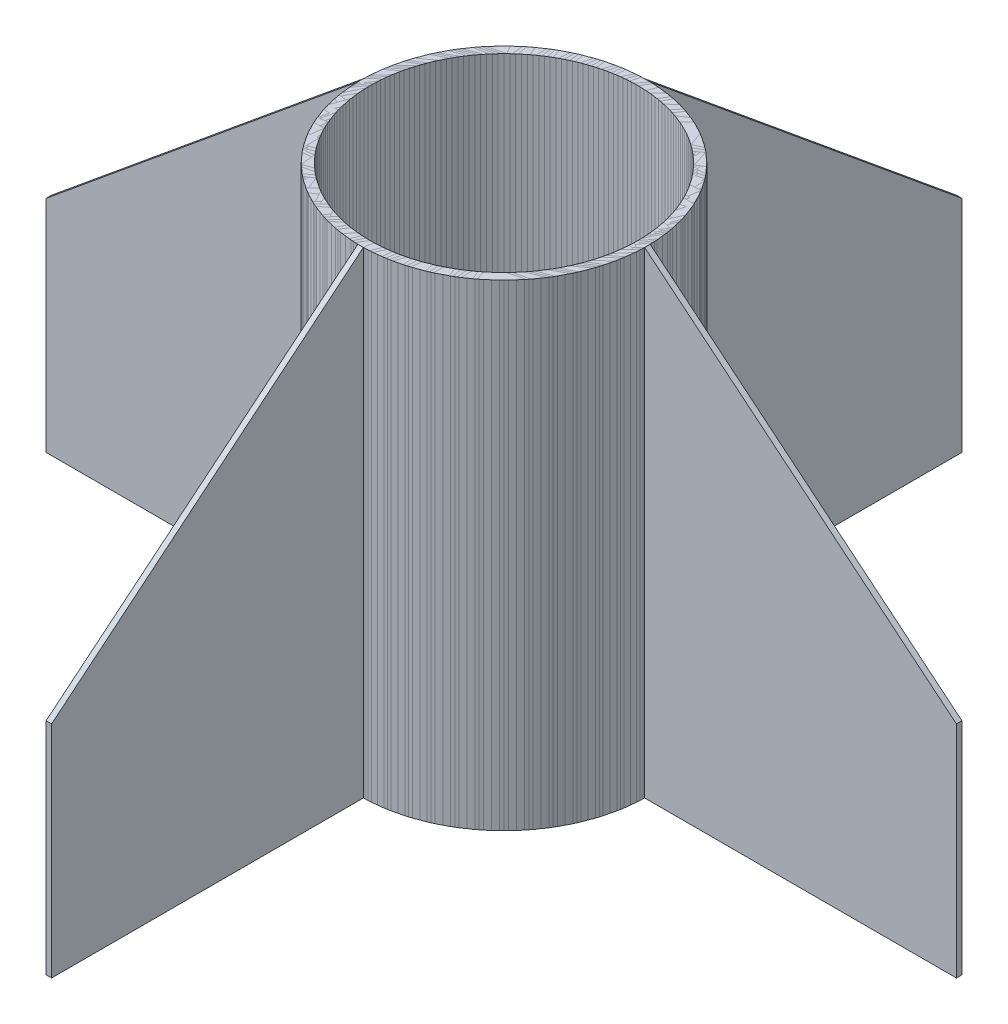
ISO-10303-21;
HEADER;
FILE_DESCRIPTION(('STEP AP214'),'2;1');
FILE_NAME('part.step','',(''),(''),'','','');
FILE_SCHEMA(('AUTOMOTIVE_DESIGN { 1 0 10303 214 1 1 1 1 }'));
ENDSEC;
DATA;
#1=APPLICATION_CONTEXT('core data for automotive mechanical design processes');
#2=APPLICATION_PROTOCOL_DEFINITION('international standard','automotive_design',2000,#1);
#3=PRODUCT_CONTEXT('',#1,'mechanical');
#4=PRODUCT('Part','Part','',(#3));
#5=PRODUCT_RELATED_PRODUCT_CATEGORY('part','',(#4));
#6=PRODUCT_DEFINITION_FORMATION('','',#4);
#7=PRODUCT_DEFINITION_CONTEXT('part definition',#1,'design');
#8=PRODUCT_DEFINITION('design','',#6,#7);
#9=PRODUCT_DEFINITION_SHAPE('','',#8);
#10=(LENGTH_UNIT() NAMED_UNIT(*) SI_UNIT(.MILLI.,.METRE.));
#11=(NAMED_UNIT(*) PLANE_ANGLE_UNIT() SI_UNIT($,.RADIAN.));
#12=(NAMED_UNIT(*) SI_UNIT($,.STERADIAN.) SOLID_ANGLE_UNIT());
#13=UNCERTAINTY_MEASURE_WITH_UNIT(LENGTH_MEASURE(1.E-05),#10,'distance_accuracy_value','');
#14=(GEOMETRIC_REPRESENTATION_CONTEXT(3) GLOBAL_UNCERTAINTY_ASSIGNED_CONTEXT((#13)) GLOBAL_UNIT_ASSIGNED_CONTEXT((#10,
#11,#12)) REPRESENTATION_CONTEXT('',''));
#15=CARTESIAN_POINT('',(0.,0.,0.));
#16=DIRECTION('',(0.,0.,1.));
#17=DIRECTION('',(1.,0.,0.));
#18=AXIS2_PLACEMENT_3D('',#15,#16,#17);
#19=CARTESIAN_POINT('',(0.,260.,0.));
#20=DIRECTION('',(0.,-1.,0.));
#21=DIRECTION('',(-1.,0.,0.));
#22=AXIS2_PLACEMENT_3D('',#19,#20,#21);
#23=CYLINDRICAL_SURFACE('',#22,78.2);
#24=DIRECTION('',(0.,-1.,0.));
#25=VECTOR('',#24,1.);
#26=CARTESIAN_POINT('',(-1.49999999999918,260.,-78.1856124872089));
#27=LINE('',#26,#25);
#28=CARTESIAN_POINT('',(-1.49999999999918,0.,-78.1856124872089));
#29=VERTEX_POINT('',#28);
#30=CARTESIAN_POINT('',(-1.49999999999918,260.,-78.1856124872089));
#31=VERTEX_POINT('',#30);
#32=EDGE_CURVE('E12',#29,#31,#27,.F.);
#33=ORIENTED_EDGE('',*,*,#32,.F.);
#34=CARTESIAN_POINT('',(0.,0.,0.));
#35=DIRECTION('',(0.,1.,0.));
#36=DIRECTION('',(1.,0.,0.));
#37=AXIS2_PLACEMENT_3D('',#34,#35,#36);
#38=CIRCLE('',#37,78.2);
#39=CARTESIAN_POINT('',(1.50000000000082,0.,-78.1856124872089));
#40=VERTEX_POINT('',#39);
#41=EDGE_CURVE('E135',#29,#40,#38,.T.);
#42=ORIENTED_EDGE('',*,*,#41,.T.);
#43=DIRECTION('',(0.,-1.,0.));
#44=VECTOR('',#43,1.);
#45=CARTESIAN_POINT('',(1.50000000000082,260.,-78.1856124872089));
#46=LINE('',#45,#44);
#47=CARTESIAN_POINT('',(1.50000000000082,260.,-78.1856124872089));
#48=VERTEX_POINT('',#47);
#49=EDGE_CURVE('E57',#40,#48,#46,.F.);
#50=ORIENTED_EDGE('',*,*,#49,.T.);
#51=CARTESIAN_POINT('',(0.,260.,0.));
#52=DIRECTION('',(0.,1.,0.));
#53=DIRECTION('',(1.,0.,0.));
#54=AXIS2_PLACEMENT_3D('',#51,#52,#53);
#55=CIRCLE('',#54,78.2);
#56=EDGE_CURVE('E138',#31,#48,#55,.T.);
#57=ORIENTED_EDGE('',*,*,#56,.F.);
#58=EDGE_LOOP('',(#33,#42,#50,#57));
#59=FACE_BOUND('',#58,.T.);
#60=ADVANCED_FACE('F50',(#59),#23,.T.);
#61=CARTESIAN_POINT('',(0.,260.,0.));
#62=DIRECTION('',(0.,1.,0.));
#63=DIRECTION('',(1.,0.,0.));
#64=AXIS2_PLACEMENT_3D('',#61,#62,#63);
#65=PLANE('',#64);
#66=DIRECTION('',(0.,0.,1.));
#67=VECTOR('',#66,1.);
#68=CARTESIAN_POINT('',(-1.49999999999918,260.,-78.2));
#69=LINE('',#68,#67);
#70=CARTESIAN_POINT('',(-1.49999999999918,260.,-78.2));
#71=VERTEX_POINT('',#70);
#72=EDGE_CURVE('E103',#71,#31,#69,.T.);
#73=ORIENTED_EDGE('',*,*,#72,.T.);
#74=ORIENTED_EDGE('',*,*,#56,.T.);
#75=DIRECTION('',(0.,0.,1.));
#76=VECTOR('',#75,1.);
#77=CARTESIAN_POINT('',(1.50000000000082,260.,-78.2));
#78=LINE('',#77,#76);
#79=CARTESIAN_POINT('',(1.50000000000082,260.,-78.2));
#80=VERTEX_POINT('',#79);
#81=EDGE_CURVE('E64',#80,#48,#78,.T.);
#82=ORIENTED_EDGE('',*,*,#81,.F.);
#83=DIRECTION('',(1.,0.,0.));
#84=VECTOR('',#83,1.);
#85=CARTESIAN_POINT('',(-1.49999999999918,260.,-78.2));
#86=LINE('',#85,#84);
#87=EDGE_CURVE('E128',#71,#80,#86,.T.);
#88=ORIENTED_EDGE('',*,*,#87,.F.);
#89=EDGE_LOOP('',(#73,#74,#82,#88));
#90=FACE_BOUND('',#89,.T.);
#91=CARTESIAN_POINT('',(0.,260.,0.));
#92=DIRECTION('',(0.,1.,0.));
#93=DIRECTION('',(1.,0.,0.));
#94=AXIS2_PLACEMENT_3D('',#91,#92,#93);
#95=CIRCLE('',#94,73.2);
#96=CARTESIAN_POINT('',(73.2,260.,7.66729302009952E-13));
#97=VERTEX_POINT('',#96);
#98=EDGE_CURVE('E132',#97,#97,#95,.T.);
#99=ORIENTED_EDGE('',*,*,#98,.F.);
#100=EDGE_LOOP('',(#99));
#101=FACE_BOUND('',#100,.T.);
#102=ADVANCED_FACE('F144',(#90,#101),#65,.T.);
#103=CARTESIAN_POINT('',(0.,0.,0.));
#104=DIRECTION('',(0.,1.,0.));
#105=DIRECTION('',(1.,0.,0.));
#106=AXIS2_PLACEMENT_3D('',#103,#104,#105);
#107=PLANE('',#106);
#108=ORIENTED_EDGE('',*,*,#41,.F.);
#109=DIRECTION('',(0.,0.,-1.));
#110=VECTOR('',#109,1.);
#111=CARTESIAN_POINT('',(-1.4999999999992,0.,-76.2));
#112=LINE('',#111,#110);
#113=CARTESIAN_POINT('',(-1.4999999999974,0.,-248.2));
#114=VERTEX_POINT('',#113);
#115=EDGE_CURVE('E71',#29,#114,#112,.T.);
#116=ORIENTED_EDGE('',*,*,#115,.T.);
#117=DIRECTION('',(1.,0.,0.));
#118=VECTOR('',#117,1.);
#119=CARTESIAN_POINT('',(-1.4999999999974,0.,-248.2));
#120=LINE('',#119,#118);
#121=CARTESIAN_POINT('',(1.5000000000026,0.,-248.2));
#122=VERTEX_POINT('',#121);
#123=EDGE_CURVE('E106',#114,#122,#120,.T.);
#124=ORIENTED_EDGE('',*,*,#123,.T.);
#125=DIRECTION('',(0.,0.,-1.));
#126=VECTOR('',#125,1.);
#127=CARTESIAN_POINT('',(1.5000000000008,0.,-76.2));
#128=LINE('',#127,#126);
#129=EDGE_CURVE('E94',#40,#122,#128,.T.);
#130=ORIENTED_EDGE('',*,*,#129,.F.);
#131=EDGE_LOOP('',(#108,#116,#124,#130));
#132=FACE_BOUND('',#131,.T.);
#133=CARTESIAN_POINT('',(0.,0.,0.));
#134=DIRECTION('',(0.,1.,0.));
#135=DIRECTION('',(1.,0.,0.));
#136=AXIS2_PLACEMENT_3D('',#133,#134,#135);
#137=CIRCLE('',#136,73.2);
#138=CARTESIAN_POINT('',(73.2,0.,7.66729302009952E-13));
#139=VERTEX_POINT('',#138);
#140=EDGE_CURVE('E131',#139,#139,#137,.T.);
#141=ORIENTED_EDGE('',*,*,#140,.T.);
#142=EDGE_LOOP('',(#141));
#143=FACE_BOUND('',#142,.T.);
#144=ADVANCED_FACE('F107',(#132,#143),#107,.F.);
#145=CARTESIAN_POINT('',(0.,260.,0.));
#146=DIRECTION('',(0.,-1.,0.));
#147=DIRECTION('',(-1.,0.,0.));
#148=AXIS2_PLACEMENT_3D('',#145,#146,#147);
#149=CYLINDRICAL_SURFACE('',#148,73.2);
#150=ORIENTED_EDGE('',*,*,#98,.T.);
#151=EDGE_LOOP('',(#150));
#152=FACE_BOUND('',#151,.T.);
#153=ORIENTED_EDGE('',*,*,#140,.F.);
#154=EDGE_LOOP('',(#153));
#155=FACE_BOUND('',#154,.T.);
#156=ADVANCED_FACE('F167',(#152,#155),#149,.F.);
#157=CARTESIAN_POINT('',(-1.5,0.,0.));
#158=DIRECTION('',(1.,0.,0.));
#159=DIRECTION('',(0.,0.,-1.));
#160=AXIS2_PLACEMENT_3D('',#157,#158,#159);
#161=PLANE('',#160);
#162=ORIENTED_EDGE('',*,*,#115,.F.);
#163=ORIENTED_EDGE('',*,*,#32,.T.);
#164=ORIENTED_EDGE('',*,*,#72,.F.);
#165=DIRECTION('',(0.,0.6357072528611,0.77193023561705));
#166=VECTOR('',#165,1.);
#167=CARTESIAN_POINT('',(-1.4999999999974,120.,-248.2));
#168=LINE('',#167,#166);
#169=CARTESIAN_POINT('',(-1.4999999999974,120.,-248.2));
#170=VERTEX_POINT('',#169);
#171=EDGE_CURVE('E112',#170,#71,#168,.T.);
#172=ORIENTED_EDGE('',*,*,#171,.F.);
#173=DIRECTION('',(0.,1.,0.));
#174=VECTOR('',#173,1.);
#175=CARTESIAN_POINT('',(-1.4999999999974,0.,-248.2));
#176=LINE('',#175,#174);
#177=EDGE_CURVE('E117',#114,#170,#176,.T.);
#178=ORIENTED_EDGE('',*,*,#177,.F.);
#179=EDGE_LOOP('',(#162,#163,#164,#172,#178));
#180=FACE_BOUND('',#179,.T.);
#181=ADVANCED_FACE('F148',(#180),#161,.F.);
#182=CARTESIAN_POINT('',(1.5,0.,0.));
#183=DIRECTION('',(1.,0.,0.));
#184=DIRECTION('',(0.,0.,-1.));
#185=AXIS2_PLACEMENT_3D('',#182,#183,#184);
#186=PLANE('',#185);
#187=ORIENTED_EDGE('',*,*,#49,.F.);
#188=ORIENTED_EDGE('',*,*,#129,.T.);
#189=DIRECTION('',(0.,1.,0.));
#190=VECTOR('',#189,1.);
#191=CARTESIAN_POINT('',(1.5000000000026,0.,-248.2));
#192=LINE('',#191,#190);
#193=CARTESIAN_POINT('',(1.5000000000026,120.,-248.2));
#194=VERTEX_POINT('',#193);
#195=EDGE_CURVE('E98',#122,#194,#192,.T.);
#196=ORIENTED_EDGE('',*,*,#195,.T.);
#197=DIRECTION('',(0.,0.6357072528611,0.77193023561705));
#198=VECTOR('',#197,1.);
#199=CARTESIAN_POINT('',(1.5000000000026,120.,-248.2));
#200=LINE('',#199,#198);
#201=EDGE_CURVE('E115',#194,#80,#200,.T.);
#202=ORIENTED_EDGE('',*,*,#201,.T.);
#203=ORIENTED_EDGE('',*,*,#81,.T.);
#204=EDGE_LOOP('',(#187,#188,#196,#202,#203));
#205=FACE_BOUND('',#204,.T.);
#206=ADVANCED_FACE('F96',(#205),#186,.T.);
#207=CARTESIAN_POINT('',(-1.4999999999974,120.,-248.2));
#208=DIRECTION('',(0.,0.77193023561705,-0.6357072528611));
#209=DIRECTION('',(0.,0.6357072528611,0.77193023561705));
#210=AXIS2_PLACEMENT_3D('',#207,#208,#209);
#211=PLANE('',#210);
#212=ORIENTED_EDGE('',*,*,#87,.T.);
#213=ORIENTED_EDGE('',*,*,#201,.F.);
#214=DIRECTION('',(1.,0.,0.));
#215=VECTOR('',#214,1.);
#216=CARTESIAN_POINT('',(-1.4999999999974,120.,-248.2));
#217=LINE('',#216,#215);
#218=EDGE_CURVE('E111',#170,#194,#217,.T.);
#219=ORIENTED_EDGE('',*,*,#218,.F.);
#220=ORIENTED_EDGE('',*,*,#171,.T.);
#221=EDGE_LOOP('',(#212,#213,#219,#220));
#222=FACE_BOUND('',#221,.T.);
#223=ADVANCED_FACE('F150',(#222),#211,.T.);
#224=CARTESIAN_POINT('',(-1.4999999999974,0.,-248.2));
#225=DIRECTION('',(0.,0.,-1.));
#226=DIRECTION('',(-1.,0.,0.));
#227=AXIS2_PLACEMENT_3D('',#224,#225,#226);
#228=PLANE('',#227);
#229=ORIENTED_EDGE('',*,*,#218,.T.);
#230=ORIENTED_EDGE('',*,*,#195,.F.);
#231=ORIENTED_EDGE('',*,*,#123,.F.);
#232=ORIENTED_EDGE('',*,*,#177,.T.);
#233=EDGE_LOOP('',(#229,#230,#231,#232));
#234=FACE_BOUND('',#233,.T.);
#235=ADVANCED_FACE('F114',(#234),#228,.T.);
#236=CLOSED_SHELL('',(#60,#102,#144,#156,#181,#206,#223,#235));
#237=MANIFOLD_SOLID_BREP('B2',#236);
#238=CARTESIAN_POINT('',(0.,260.,0.));
#239=DIRECTION('',(0.,-1.,0.));
#240=DIRECTION('',(0.,0.,1.));
#241=AXIS2_PLACEMENT_3D('',#238,#239,#240);
#242=CYLINDRICAL_SURFACE('',#241,78.2);
#243=DIRECTION('',(0.,-1.,0.));
#244=VECTOR('',#243,1.);
#245=CARTESIAN_POINT('',(-78.1856124872089,260.,1.5));
#246=LINE('',#245,#244);
#247=CARTESIAN_POINT('',(-78.1856124872089,0.,1.5));
#248=VERTEX_POINT('',#247);
#249=CARTESIAN_POINT('',(-78.1856124872089,260.,1.5));
#250=VERTEX_POINT('',#249);
#251=EDGE_CURVE('E48',#248,#250,#246,.F.);
#252=ORIENTED_EDGE('',*,*,#251,.F.);
#253=CARTESIAN_POINT('',(0.,0.,0.));
#254=DIRECTION('',(0.,1.,0.));
#255=DIRECTION('',(0.,0.,-1.));
#256=AXIS2_PLACEMENT_3D('',#253,#254,#255);
#257=CIRCLE('',#256,78.2);
#258=CARTESIAN_POINT('',(-78.1856124872089,0.,-1.5));
#259=VERTEX_POINT('',#258);
#260=EDGE_CURVE('E333',#248,#259,#257,.T.);
#261=ORIENTED_EDGE('',*,*,#260,.T.);
#262=DIRECTION('',(0.,-1.,0.));
#263=VECTOR('',#262,1.);
#264=CARTESIAN_POINT('',(-78.1856124872089,260.,-1.5));
#265=LINE('',#264,#263);
#266=CARTESIAN_POINT('',(-78.1856124872089,260.,-1.5));
#267=VERTEX_POINT('',#266);
#268=EDGE_CURVE('E255',#259,#267,#265,.F.);
#269=ORIENTED_EDGE('',*,*,#268,.T.);
#270=CARTESIAN_POINT('',(0.,260.,0.));
#271=DIRECTION('',(0.,1.,0.));
#272=DIRECTION('',(0.,0.,-1.));
#273=AXIS2_PLACEMENT_3D('',#270,#271,#272);
#274=CIRCLE('',#273,78.2);
#275=EDGE_CURVE('E336',#250,#267,#274,.T.);
#276=ORIENTED_EDGE('',*,*,#275,.F.);
#277=EDGE_LOOP('',(#252,#261,#269,#276));
#278=FACE_BOUND('',#277,.T.);
#279=ADVANCED_FACE('F248',(#278),#242,.T.);
#280=CARTESIAN_POINT('',(0.,260.,0.));
#281=DIRECTION('',(0.,1.,0.));
#282=DIRECTION('',(0.,0.,-1.));
#283=AXIS2_PLACEMENT_3D('',#280,#281,#282);
#284=PLANE('',#283);
#285=DIRECTION('',(1.,0.,0.));
#286=VECTOR('',#285,1.);
#287=CARTESIAN_POINT('',(-78.2,260.,1.5));
#288=LINE('',#287,#286);
#289=CARTESIAN_POINT('',(-78.2,260.,1.5));
#290=VERTEX_POINT('',#289);
#291=EDGE_CURVE('E301',#290,#250,#288,.T.);
#292=ORIENTED_EDGE('',*,*,#291,.T.);
#293=ORIENTED_EDGE('',*,*,#275,.T.);
#294=DIRECTION('',(1.,0.,0.));
#295=VECTOR('',#294,1.);
#296=CARTESIAN_POINT('',(-78.2,260.,-1.5));
#297=LINE('',#296,#295);
#298=CARTESIAN_POINT('',(-78.2,260.,-1.5));
#299=VERTEX_POINT('',#298);
#300=EDGE_CURVE('E262',#299,#267,#297,.T.);
#301=ORIENTED_EDGE('',*,*,#300,.F.);
#302=DIRECTION('',(0.,0.,-1.));
#303=VECTOR('',#302,1.);
#304=CARTESIAN_POINT('',(-78.2,260.,1.5));
#305=LINE('',#304,#303);
#306=EDGE_CURVE('E326',#290,#299,#305,.T.);
#307=ORIENTED_EDGE('',*,*,#306,.F.);
#308=EDGE_LOOP('',(#292,#293,#301,#307));
#309=FACE_BOUND('',#308,.T.);
#310=CARTESIAN_POINT('',(0.,260.,0.));
#311=DIRECTION('',(0.,1.,0.));
#312=DIRECTION('',(0.,0.,-1.));
#313=AXIS2_PLACEMENT_3D('',#310,#311,#312);
#314=CIRCLE('',#313,73.2);
#315=CARTESIAN_POINT('',(0.,260.,-73.2));
#316=VERTEX_POINT('',#315);
#317=EDGE_CURVE('E330',#316,#316,#314,.T.);
#318=ORIENTED_EDGE('',*,*,#317,.F.);
#319=EDGE_LOOP('',(#318));
#320=FACE_BOUND('',#319,.T.);
#321=ADVANCED_FACE('F342',(#309,#320),#284,.T.);
#322=CARTESIAN_POINT('',(0.,0.,0.));
#323=DIRECTION('',(0.,1.,0.));
#324=DIRECTION('',(0.,0.,-1.));
#325=AXIS2_PLACEMENT_3D('',#322,#323,#324);
#326=PLANE('',#325);
#327=ORIENTED_EDGE('',*,*,#260,.F.);
#328=DIRECTION('',(-1.,0.,0.));
#329=VECTOR('',#328,1.);
#330=CARTESIAN_POINT('',(-76.2,0.,1.5));
#331=LINE('',#330,#329);
#332=CARTESIAN_POINT('',(-248.2,0.,1.5));
#333=VERTEX_POINT('',#332);
#334=EDGE_CURVE('E269',#248,#333,#331,.T.);
#335=ORIENTED_EDGE('',*,*,#334,.T.);
#336=DIRECTION('',(0.,0.,-1.));
#337=VECTOR('',#336,1.);
#338=CARTESIAN_POINT('',(-248.2,0.,1.5));
#339=LINE('',#338,#337);
#340=CARTESIAN_POINT('',(-248.2,0.,-1.5));
#341=VERTEX_POINT('',#340);
#342=EDGE_CURVE('E304',#333,#341,#339,.T.);
#343=ORIENTED_EDGE('',*,*,#342,.T.);
#344=DIRECTION('',(-1.,0.,0.));
#345=VECTOR('',#344,1.);
#346=CARTESIAN_POINT('',(-76.2,0.,-1.5));
#347=LINE('',#346,#345);
#348=EDGE_CURVE('E292',#259,#341,#347,.T.);
#349=ORIENTED_EDGE('',*,*,#348,.F.);
#350=EDGE_LOOP('',(#327,#335,#343,#349));
#351=FACE_BOUND('',#350,.T.);
#352=CARTESIAN_POINT('',(0.,0.,0.));
#353=DIRECTION('',(0.,1.,0.));
#354=DIRECTION('',(0.,0.,-1.));
#355=AXIS2_PLACEMENT_3D('',#352,#353,#354);
#356=CIRCLE('',#355,73.2);
#357=CARTESIAN_POINT('',(0.,0.,-73.2));
#358=VERTEX_POINT('',#357);
#359=EDGE_CURVE('E329',#358,#358,#356,.T.);
#360=ORIENTED_EDGE('',*,*,#359,.T.);
#361=EDGE_LOOP('',(#360));
#362=FACE_BOUND('',#361,.T.);
#363=ADVANCED_FACE('F305',(#351,#362),#326,.F.);
#364=CARTESIAN_POINT('',(0.,260.,0.));
#365=DIRECTION('',(0.,-1.,0.));
#366=DIRECTION('',(0.,0.,1.));
#367=AXIS2_PLACEMENT_3D('',#364,#365,#366);
#368=CYLINDRICAL_SURFACE('',#367,73.2);
#369=ORIENTED_EDGE('',*,*,#317,.T.);
#370=EDGE_LOOP('',(#369));
#371=FACE_BOUND('',#370,.T.);
#372=ORIENTED_EDGE('',*,*,#359,.F.);
#373=EDGE_LOOP('',(#372));
#374=FACE_BOUND('',#373,.T.);
#375=ADVANCED_FACE('F365',(#371,#374),#368,.F.);
#376=CARTESIAN_POINT('',(0.,0.,1.5));
#377=DIRECTION('',(0.,0.,-1.));
#378=DIRECTION('',(-1.,0.,0.));
#379=AXIS2_PLACEMENT_3D('',#376,#377,#378);
#380=PLANE('',#379);
#381=ORIENTED_EDGE('',*,*,#334,.F.);
#382=ORIENTED_EDGE('',*,*,#251,.T.);
#383=ORIENTED_EDGE('',*,*,#291,.F.);
#384=DIRECTION('',(0.77193023561705,0.6357072528611,0.));
#385=VECTOR('',#384,1.);
#386=CARTESIAN_POINT('',(-248.2,120.,1.5));
#387=LINE('',#386,#385);
#388=CARTESIAN_POINT('',(-248.2,120.,1.5));
#389=VERTEX_POINT('',#388);
#390=EDGE_CURVE('E310',#389,#290,#387,.T.);
#391=ORIENTED_EDGE('',*,*,#390,.F.);
#392=DIRECTION('',(0.,1.,0.));
#393=VECTOR('',#392,1.);
#394=CARTESIAN_POINT('',(-248.2,0.,1.5));
#395=LINE('',#394,#393);
#396=EDGE_CURVE('E315',#333,#389,#395,.T.);
#397=ORIENTED_EDGE('',*,*,#396,.F.);
#398=EDGE_LOOP('',(#381,#382,#383,#391,#397));
#399=FACE_BOUND('',#398,.T.);
#400=ADVANCED_FACE('F346',(#399),#380,.F.);
#401=CARTESIAN_POINT('',(0.,0.,-1.5));
#402=DIRECTION('',(0.,0.,-1.));
#403=DIRECTION('',(-1.,0.,0.));
#404=AXIS2_PLACEMENT_3D('',#401,#402,#403);
#405=PLANE('',#404);
#406=ORIENTED_EDGE('',*,*,#268,.F.);
#407=ORIENTED_EDGE('',*,*,#348,.T.);
#408=DIRECTION('',(0.,1.,0.));
#409=VECTOR('',#408,1.);
#410=CARTESIAN_POINT('',(-248.2,0.,-1.5));
#411=LINE('',#410,#409);
#412=CARTESIAN_POINT('',(-248.2,120.,-1.5));
#413=VERTEX_POINT('',#412);
#414=EDGE_CURVE('E296',#341,#413,#411,.T.);
#415=ORIENTED_EDGE('',*,*,#414,.T.);
#416=DIRECTION('',(0.77193023561705,0.6357072528611,0.));
#417=VECTOR('',#416,1.);
#418=CARTESIAN_POINT('',(-248.2,120.,-1.5));
#419=LINE('',#418,#417);
#420=EDGE_CURVE('E313',#413,#299,#419,.T.);
#421=ORIENTED_EDGE('',*,*,#420,.T.);
#422=ORIENTED_EDGE('',*,*,#300,.T.);
#423=EDGE_LOOP('',(#406,#407,#415,#421,#422));
#424=FACE_BOUND('',#423,.T.);
#425=ADVANCED_FACE('F294',(#424),#405,.T.);
#426=CARTESIAN_POINT('',(-248.2,120.,1.5));
#427=DIRECTION('',(-0.6357072528611,0.77193023561705,0.));
#428=DIRECTION('',(0.77193023561705,0.6357072528611,0.));
#429=AXIS2_PLACEMENT_3D('',#426,#427,#428);
#430=PLANE('',#429);
#431=ORIENTED_EDGE('',*,*,#306,.T.);
#432=ORIENTED_EDGE('',*,*,#420,.F.);
#433=DIRECTION('',(0.,0.,-1.));
#434=VECTOR('',#433,1.);
#435=CARTESIAN_POINT('',(-248.2,120.,1.5));
#436=LINE('',#435,#434);
#437=EDGE_CURVE('E309',#389,#413,#436,.T.);
#438=ORIENTED_EDGE('',*,*,#437,.F.);
#439=ORIENTED_EDGE('',*,*,#390,.T.);
#440=EDGE_LOOP('',(#431,#432,#438,#439));
#441=FACE_BOUND('',#440,.T.);
#442=ADVANCED_FACE('F348',(#441),#430,.T.);
#443=CARTESIAN_POINT('',(-248.2,0.,1.5));
#444=DIRECTION('',(-1.,0.,0.));
#445=DIRECTION('',(0.,0.,1.));
#446=AXIS2_PLACEMENT_3D('',#443,#444,#445);
#447=PLANE('',#446);
#448=ORIENTED_EDGE('',*,*,#437,.T.);
#449=ORIENTED_EDGE('',*,*,#414,.F.);
#450=ORIENTED_EDGE('',*,*,#342,.F.);
#451=ORIENTED_EDGE('',*,*,#396,.T.);
#452=EDGE_LOOP('',(#448,#449,#450,#451));
#453=FACE_BOUND('',#452,.T.);
#454=ADVANCED_FACE('F312',(#453),#447,.T.);
#455=CLOSED_SHELL('',(#279,#321,#363,#375,#400,#425,#442,#454));
#456=MANIFOLD_SOLID_BREP('B6',#455);
#457=CARTESIAN_POINT('',(0.,260.,0.));
#458=DIRECTION('',(0.,-1.,0.));
#459=DIRECTION('',(1.,0.,0.));
#460=AXIS2_PLACEMENT_3D('',#457,#458,#459);
#461=CYLINDRICAL_SURFACE('',#460,78.2);
#462=DIRECTION('',(0.,-1.,0.));
#463=VECTOR('',#462,1.);
#464=CARTESIAN_POINT('',(1.49999999999973,260.,78.1856124872089));
#465=LINE('',#464,#463);
#466=CARTESIAN_POINT('',(1.49999999999973,0.,78.1856124872089));
#467=VERTEX_POINT('',#466);
#468=CARTESIAN_POINT('',(1.49999999999973,260.,78.1856124872089));
#469=VERTEX_POINT('',#468);
#470=EDGE_CURVE('E246',#467,#469,#465,.F.);
#471=ORIENTED_EDGE('',*,*,#470,.F.);
#472=CARTESIAN_POINT('',(0.,0.,0.));
#473=DIRECTION('',(0.,1.,0.));
#474=DIRECTION('',(-1.,0.,0.));
#475=AXIS2_PLACEMENT_3D('',#472,#473,#474);
#476=CIRCLE('',#475,78.2);
#477=CARTESIAN_POINT('',(-1.50000000000027,0.,78.1856124872089));
#478=VERTEX_POINT('',#477);
#479=EDGE_CURVE('E530',#467,#478,#476,.T.);
#480=ORIENTED_EDGE('',*,*,#479,.T.);
#481=DIRECTION('',(0.,-1.,0.));
#482=VECTOR('',#481,1.);
#483=CARTESIAN_POINT('',(-1.50000000000027,260.,78.1856124872089));
#484=LINE('',#483,#482);
#485=CARTESIAN_POINT('',(-1.50000000000027,260.,78.1856124872089));
#486=VERTEX_POINT('',#485);
#487=EDGE_CURVE('E452',#478,#486,#484,.F.);
#488=ORIENTED_EDGE('',*,*,#487,.T.);
#489=CARTESIAN_POINT('',(0.,260.,0.));
#490=DIRECTION('',(0.,1.,0.));
#491=DIRECTION('',(-1.,0.,0.));
#492=AXIS2_PLACEMENT_3D('',#489,#490,#491);
#493=CIRCLE('',#492,78.2);
#494=EDGE_CURVE('E533',#469,#486,#493,.T.);
#495=ORIENTED_EDGE('',*,*,#494,.F.);
#496=EDGE_LOOP('',(#471,#480,#488,#495));
#497=FACE_BOUND('',#496,.T.);
#498=ADVANCED_FACE('F445',(#497),#461,.T.);
#499=CARTESIAN_POINT('',(0.,260.,0.));
#500=DIRECTION('',(0.,1.,0.));
#501=DIRECTION('',(-1.,0.,0.));
#502=AXIS2_PLACEMENT_3D('',#499,#500,#501);
#503=PLANE('',#502);
#504=DIRECTION('',(0.,0.,-1.));
#505=VECTOR('',#504,1.);
#506=CARTESIAN_POINT('',(1.49999999999973,260.,78.2));
#507=LINE('',#506,#505);
#508=CARTESIAN_POINT('',(1.49999999999973,260.,78.2));
#509=VERTEX_POINT('',#508);
#510=EDGE_CURVE('E498',#509,#469,#507,.T.);
#511=ORIENTED_EDGE('',*,*,#510,.T.);
#512=ORIENTED_EDGE('',*,*,#494,.T.);
#513=DIRECTION('',(0.,0.,-1.));
#514=VECTOR('',#513,1.);
#515=CARTESIAN_POINT('',(-1.50000000000027,260.,78.2));
#516=LINE('',#515,#514);
#517=CARTESIAN_POINT('',(-1.50000000000027,260.,78.2));
#518=VERTEX_POINT('',#517);
#519=EDGE_CURVE('E459',#518,#486,#516,.T.);
#520=ORIENTED_EDGE('',*,*,#519,.F.);
#521=DIRECTION('',(-1.,0.,0.));
#522=VECTOR('',#521,1.);
#523=CARTESIAN_POINT('',(1.49999999999973,260.,78.2));
#524=LINE('',#523,#522);
#525=EDGE_CURVE('E523',#509,#518,#524,.T.);
#526=ORIENTED_EDGE('',*,*,#525,.F.);
#527=EDGE_LOOP('',(#511,#512,#520,#526));
#528=FACE_BOUND('',#527,.T.);
#529=CARTESIAN_POINT('',(0.,260.,0.));
#530=DIRECTION('',(0.,1.,0.));
#531=DIRECTION('',(-1.,0.,0.));
#532=AXIS2_PLACEMENT_3D('',#529,#530,#531);
#533=CIRCLE('',#532,73.2);
#534=CARTESIAN_POINT('',(-73.2,260.,-2.55576434003317E-13));
#535=VERTEX_POINT('',#534);
#536=EDGE_CURVE('E527',#535,#535,#533,.T.);
#537=ORIENTED_EDGE('',*,*,#536,.F.);
#538=EDGE_LOOP('',(#537));
#539=FACE_BOUND('',#538,.T.);
#540=ADVANCED_FACE('F539',(#528,#539),#503,.T.);
#541=CARTESIAN_POINT('',(0.,0.,0.));
#542=DIRECTION('',(0.,1.,0.));
#543=DIRECTION('',(-1.,0.,0.));
#544=AXIS2_PLACEMENT_3D('',#541,#542,#543);
#545=PLANE('',#544);
#546=ORIENTED_EDGE('',*,*,#479,.F.);
#547=DIRECTION('',(0.,0.,1.));
#548=VECTOR('',#547,1.);
#549=CARTESIAN_POINT('',(1.49999999999973,0.,76.2));
#550=LINE('',#549,#548);
#551=CARTESIAN_POINT('',(1.49999999999913,0.,248.2));
#552=VERTEX_POINT('',#551);
#553=EDGE_CURVE('E466',#467,#552,#550,.T.);
#554=ORIENTED_EDGE('',*,*,#553,.T.);
#555=DIRECTION('',(-1.,0.,0.));
#556=VECTOR('',#555,1.);
#557=CARTESIAN_POINT('',(1.49999999999913,0.,248.2));
#558=LINE('',#557,#556);
#559=CARTESIAN_POINT('',(-1.50000000000087,0.,248.2));
#560=VERTEX_POINT('',#559);
#561=EDGE_CURVE('E501',#552,#560,#558,.T.);
#562=ORIENTED_EDGE('',*,*,#561,.T.);
#563=DIRECTION('',(0.,0.,1.));
#564=VECTOR('',#563,1.);
#565=CARTESIAN_POINT('',(-1.50000000000027,0.,76.2));
#566=LINE('',#565,#564);
#567=EDGE_CURVE('E489',#478,#560,#566,.T.);
#568=ORIENTED_EDGE('',*,*,#567,.F.);
#569=EDGE_LOOP('',(#546,#554,#562,#568));
#570=FACE_BOUND('',#569,.T.);
#571=CARTESIAN_POINT('',(0.,0.,0.));
#572=DIRECTION('',(0.,1.,0.));
#573=DIRECTION('',(-1.,0.,0.));
#574=AXIS2_PLACEMENT_3D('',#571,#572,#573);
#575=CIRCLE('',#574,73.2);
#576=CARTESIAN_POINT('',(-73.2,0.,-2.55576434003317E-13));
#577=VERTEX_POINT('',#576);
#578=EDGE_CURVE('E526',#577,#577,#575,.T.);
#579=ORIENTED_EDGE('',*,*,#578,.T.);
#580=EDGE_LOOP('',(#579));
#581=FACE_BOUND('',#580,.T.);
#582=ADVANCED_FACE('F502',(#570,#581),#545,.F.);
#583=CARTESIAN_POINT('',(0.,260.,0.));
#584=DIRECTION('',(0.,-1.,0.));
#585=DIRECTION('',(1.,0.,0.));
#586=AXIS2_PLACEMENT_3D('',#583,#584,#585);
#587=CYLINDRICAL_SURFACE('',#586,73.2);
#588=ORIENTED_EDGE('',*,*,#536,.T.);
#589=EDGE_LOOP('',(#588));
#590=FACE_BOUND('',#589,.T.);
#591=ORIENTED_EDGE('',*,*,#578,.F.);
#592=EDGE_LOOP('',(#591));
#593=FACE_BOUND('',#592,.T.);
#594=ADVANCED_FACE('F562',(#590,#593),#587,.F.);
#595=CARTESIAN_POINT('',(1.5,0.,0.));
#596=DIRECTION('',(-1.,0.,0.));
#597=DIRECTION('',(0.,0.,1.));
#598=AXIS2_PLACEMENT_3D('',#595,#596,#597);
#599=PLANE('',#598);
#600=ORIENTED_EDGE('',*,*,#553,.F.);
#601=ORIENTED_EDGE('',*,*,#470,.T.);
#602=ORIENTED_EDGE('',*,*,#510,.F.);
#603=DIRECTION('',(0.,0.6357072528611,-0.77193023561705));
#604=VECTOR('',#603,1.);
#605=CARTESIAN_POINT('',(1.49999999999913,120.,248.2));
#606=LINE('',#605,#604);
#607=CARTESIAN_POINT('',(1.49999999999913,120.,248.2));
#608=VERTEX_POINT('',#607);
#609=EDGE_CURVE('E507',#608,#509,#606,.T.);
#610=ORIENTED_EDGE('',*,*,#609,.F.);
#611=DIRECTION('',(0.,1.,0.));
#612=VECTOR('',#611,1.);
#613=CARTESIAN_POINT('',(1.49999999999913,0.,248.2));
#614=LINE('',#613,#612);
#615=EDGE_CURVE('E512',#552,#608,#614,.T.);
#616=ORIENTED_EDGE('',*,*,#615,.F.);
#617=EDGE_LOOP('',(#600,#601,#602,#610,#616));
#618=FACE_BOUND('',#617,.T.);
#619=ADVANCED_FACE('F543',(#618),#599,.F.);
#620=CARTESIAN_POINT('',(-1.5,0.,0.));
#621=DIRECTION('',(-1.,0.,0.));
#622=DIRECTION('',(0.,0.,1.));
#623=AXIS2_PLACEMENT_3D('',#620,#621,#622);
#624=PLANE('',#623);
#625=ORIENTED_EDGE('',*,*,#487,.F.);
#626=ORIENTED_EDGE('',*,*,#567,.T.);
#627=DIRECTION('',(0.,1.,0.));
#628=VECTOR('',#627,1.);
#629=CARTESIAN_POINT('',(-1.50000000000087,0.,248.2));
#630=LINE('',#629,#628);
#631=CARTESIAN_POINT('',(-1.50000000000087,120.,248.2));
#632=VERTEX_POINT('',#631);
#633=EDGE_CURVE('E493',#560,#632,#630,.T.);
#634=ORIENTED_EDGE('',*,*,#633,.T.);
#635=DIRECTION('',(0.,0.6357072528611,-0.77193023561705));
#636=VECTOR('',#635,1.);
#637=CARTESIAN_POINT('',(-1.50000000000087,120.,248.2));
#638=LINE('',#637,#636);
#639=EDGE_CURVE('E510',#632,#518,#638,.T.);
#640=ORIENTED_EDGE('',*,*,#639,.T.);
#641=ORIENTED_EDGE('',*,*,#519,.T.);
#642=EDGE_LOOP('',(#625,#626,#634,#640,#641));
#643=FACE_BOUND('',#642,.T.);
#644=ADVANCED_FACE('F491',(#643),#624,.T.);
#645=CARTESIAN_POINT('',(1.49999999999913,120.,248.2));
#646=DIRECTION('',(0.,0.77193023561705,0.6357072528611));
#647=DIRECTION('',(0.,0.6357072528611,-0.77193023561705));
#648=AXIS2_PLACEMENT_3D('',#645,#646,#647);
#649=PLANE('',#648);
#650=ORIENTED_EDGE('',*,*,#525,.T.);
#651=ORIENTED_EDGE('',*,*,#639,.F.);
#652=DIRECTION('',(-1.,0.,0.));
#653=VECTOR('',#652,1.);
#654=CARTESIAN_POINT('',(1.49999999999913,120.,248.2));
#655=LINE('',#654,#653);
#656=EDGE_CURVE('E506',#608,#632,#655,.T.);
#657=ORIENTED_EDGE('',*,*,#656,.F.);
#658=ORIENTED_EDGE('',*,*,#609,.T.);
#659=EDGE_LOOP('',(#650,#651,#657,#658));
#660=FACE_BOUND('',#659,.T.);
#661=ADVANCED_FACE('F545',(#660),#649,.T.);
#662=CARTESIAN_POINT('',(1.49999999999913,0.,248.2));
#663=DIRECTION('',(0.,0.,1.));
#664=DIRECTION('',(1.,0.,0.));
#665=AXIS2_PLACEMENT_3D('',#662,#663,#664);
#666=PLANE('',#665);
#667=ORIENTED_EDGE('',*,*,#656,.T.);
#668=ORIENTED_EDGE('',*,*,#633,.F.);
#669=ORIENTED_EDGE('',*,*,#561,.F.);
#670=ORIENTED_EDGE('',*,*,#615,.T.);
#671=EDGE_LOOP('',(#667,#668,#669,#670));
#672=FACE_BOUND('',#671,.T.);
#673=ADVANCED_FACE('F509',(#672),#666,.T.);
#674=CLOSED_SHELL('',(#498,#540,#582,#594,#619,#644,#661,#673));
#675=MANIFOLD_SOLID_BREP('B42',#674);
#676=CARTESIAN_POINT('',(0.,260.,0.));
#677=DIRECTION('',(0.,-1.,0.));
#678=DIRECTION('',(0.,0.,-1.));
#679=AXIS2_PLACEMENT_3D('',#676,#677,#678);
#680=CYLINDRICAL_SURFACE('',#679,78.2);
#681=DIRECTION('',(0.,-1.,0.));
#682=VECTOR('',#681,1.);
#683=CARTESIAN_POINT('',(78.1856124872089,260.,-1.5));
#684=LINE('',#683,#682);
#685=CARTESIAN_POINT('',(78.1856124872089,0.,-1.5));
#686=VERTEX_POINT('',#685);
#687=CARTESIAN_POINT('',(78.1856124872089,260.,-1.5));
#688=VERTEX_POINT('',#687);
#689=EDGE_CURVE('E443',#686,#688,#684,.F.);
#690=ORIENTED_EDGE('',*,*,#689,.F.);
#691=CARTESIAN_POINT('',(0.,0.,0.));
#692=DIRECTION('',(0.,1.,0.));
#693=DIRECTION('',(0.,0.,1.));
#694=AXIS2_PLACEMENT_3D('',#691,#692,#693);
#695=CIRCLE('',#694,78.2);
#696=CARTESIAN_POINT('',(78.1856124872089,0.,1.5));
#697=VERTEX_POINT('',#696);
#698=EDGE_CURVE('E718',#686,#697,#695,.T.);
#699=ORIENTED_EDGE('',*,*,#698,.T.);
#700=DIRECTION('',(0.,-1.,0.));
#701=VECTOR('',#700,1.);
#702=CARTESIAN_POINT('',(78.1856124872089,260.,1.5));
#703=LINE('',#702,#701);
#704=CARTESIAN_POINT('',(78.1856124872089,260.,1.5));
#705=VERTEX_POINT('',#704);
#706=EDGE_CURVE('E640',#697,#705,#703,.F.);
#707=ORIENTED_EDGE('',*,*,#706,.T.);
#708=CARTESIAN_POINT('',(0.,260.,0.));
#709=DIRECTION('',(0.,1.,0.));
#710=DIRECTION('',(0.,0.,1.));
#711=AXIS2_PLACEMENT_3D('',#708,#709,#710);
#712=CIRCLE('',#711,78.2);
#713=EDGE_CURVE('E721',#688,#705,#712,.T.);
#714=ORIENTED_EDGE('',*,*,#713,.F.);
#715=EDGE_LOOP('',(#690,#699,#707,#714));
#716=FACE_BOUND('',#715,.T.);
#717=ADVANCED_FACE('F633',(#716),#680,.T.);
#718=CARTESIAN_POINT('',(0.,260.,0.));
#719=DIRECTION('',(0.,1.,0.));
#720=DIRECTION('',(0.,0.,1.));
#721=AXIS2_PLACEMENT_3D('',#718,#719,#720);
#722=PLANE('',#721);
#723=DIRECTION('',(-1.,0.,0.));
#724=VECTOR('',#723,1.);
#725=CARTESIAN_POINT('',(78.2,260.,-1.5));
#726=LINE('',#725,#724);
#727=CARTESIAN_POINT('',(78.2,260.,-1.5));
#728=VERTEX_POINT('',#727);
#729=EDGE_CURVE('E686',#728,#688,#726,.T.);
#730=ORIENTED_EDGE('',*,*,#729,.T.);
#731=ORIENTED_EDGE('',*,*,#713,.T.);
#732=DIRECTION('',(-1.,0.,0.));
#733=VECTOR('',#732,1.);
#734=CARTESIAN_POINT('',(78.2,260.,1.5));
#735=LINE('',#734,#733);
#736=CARTESIAN_POINT('',(78.2,260.,1.5));
#737=VERTEX_POINT('',#736);
#738=EDGE_CURVE('E647',#737,#705,#735,.T.);
#739=ORIENTED_EDGE('',*,*,#738,.F.);
#740=DIRECTION('',(0.,0.,1.));
#741=VECTOR('',#740,1.);
#742=CARTESIAN_POINT('',(78.2,260.,-1.5));
#743=LINE('',#742,#741);
#744=EDGE_CURVE('E711',#728,#737,#743,.T.);
#745=ORIENTED_EDGE('',*,*,#744,.F.);
#746=EDGE_LOOP('',(#730,#731,#739,#745));
#747=FACE_BOUND('',#746,.T.);
#748=CARTESIAN_POINT('',(0.,260.,0.));
#749=DIRECTION('',(0.,1.,0.));
#750=DIRECTION('',(0.,0.,1.));
#751=AXIS2_PLACEMENT_3D('',#748,#749,#750);
#752=CIRCLE('',#751,73.2);
#753=CARTESIAN_POINT('',(0.,260.,73.2));
#754=VERTEX_POINT('',#753);
#755=EDGE_CURVE('E715',#754,#754,#752,.T.);
#756=ORIENTED_EDGE('',*,*,#755,.F.);
#757=EDGE_LOOP('',(#756));
#758=FACE_BOUND('',#757,.T.);
#759=ADVANCED_FACE('F727',(#747,#758),#722,.T.);
#760=CARTESIAN_POINT('',(0.,0.,0.));
#761=DIRECTION('',(0.,1.,0.));
#762=DIRECTION('',(0.,0.,1.));
#763=AXIS2_PLACEMENT_3D('',#760,#761,#762);
#764=PLANE('',#763);
#765=ORIENTED_EDGE('',*,*,#698,.F.);
#766=DIRECTION('',(1.,0.,0.));
#767=VECTOR('',#766,1.);
#768=CARTESIAN_POINT('',(76.2,0.,-1.5));
#769=LINE('',#768,#767);
#770=CARTESIAN_POINT('',(248.2,0.,-1.5));
#771=VERTEX_POINT('',#770);
#772=EDGE_CURVE('E654',#686,#771,#769,.T.);
#773=ORIENTED_EDGE('',*,*,#772,.T.);
#774=DIRECTION('',(0.,0.,1.));
#775=VECTOR('',#774,1.);
#776=CARTESIAN_POINT('',(248.2,0.,-1.5));
#777=LINE('',#776,#775);
#778=CARTESIAN_POINT('',(248.2,0.,1.5));
#779=VERTEX_POINT('',#778);
#780=EDGE_CURVE('E689',#771,#779,#777,.T.);
#781=ORIENTED_EDGE('',*,*,#780,.T.);
#782=DIRECTION('',(1.,0.,0.));
#783=VECTOR('',#782,1.);
#784=CARTESIAN_POINT('',(76.2,0.,1.5));
#785=LINE('',#784,#783);
#786=EDGE_CURVE('E677',#697,#779,#785,.T.);
#787=ORIENTED_EDGE('',*,*,#786,.F.);
#788=EDGE_LOOP('',(#765,#773,#781,#787));
#789=FACE_BOUND('',#788,.T.);
#790=CARTESIAN_POINT('',(0.,0.,0.));
#791=DIRECTION('',(0.,1.,0.));
#792=DIRECTION('',(0.,0.,1.));
#793=AXIS2_PLACEMENT_3D('',#790,#791,#792);
#794=CIRCLE('',#793,73.2);
#795=CARTESIAN_POINT('',(0.,0.,73.2));
#796=VERTEX_POINT('',#795);
#797=EDGE_CURVE('E714',#796,#796,#794,.T.);
#798=ORIENTED_EDGE('',*,*,#797,.T.);
#799=EDGE_LOOP('',(#798));
#800=FACE_BOUND('',#799,.T.);
#801=ADVANCED_FACE('F690',(#789,#800),#764,.F.);
#802=CARTESIAN_POINT('',(0.,260.,0.));
#803=DIRECTION('',(0.,-1.,0.));
#804=DIRECTION('',(0.,0.,-1.));
#805=AXIS2_PLACEMENT_3D('',#802,#803,#804);
#806=CYLINDRICAL_SURFACE('',#805,73.2);
#807=ORIENTED_EDGE('',*,*,#755,.T.);
#808=EDGE_LOOP('',(#807));
#809=FACE_BOUND('',#808,.T.);
#810=ORIENTED_EDGE('',*,*,#797,.F.);
#811=EDGE_LOOP('',(#810));
#812=FACE_BOUND('',#811,.T.);
#813=ADVANCED_FACE('F750',(#809,#812),#806,.F.);
#814=CARTESIAN_POINT('',(0.,0.,-1.5));
#815=DIRECTION('',(0.,0.,1.));
#816=DIRECTION('',(1.,0.,0.));
#817=AXIS2_PLACEMENT_3D('',#814,#815,#816);
#818=PLANE('',#817);
#819=ORIENTED_EDGE('',*,*,#772,.F.);
#820=ORIENTED_EDGE('',*,*,#689,.T.);
#821=ORIENTED_EDGE('',*,*,#729,.F.);
#822=DIRECTION('',(-0.77193023561705,0.6357072528611,0.));
#823=VECTOR('',#822,1.);
#824=CARTESIAN_POINT('',(248.2,120.,-1.5));
#825=LINE('',#824,#823);
#826=CARTESIAN_POINT('',(248.2,120.,-1.5));
#827=VERTEX_POINT('',#826);
#828=EDGE_CURVE('E695',#827,#728,#825,.T.);
#829=ORIENTED_EDGE('',*,*,#828,.F.);
#830=DIRECTION('',(0.,1.,0.));
#831=VECTOR('',#830,1.);
#832=CARTESIAN_POINT('',(248.2,0.,-1.5));
#833=LINE('',#832,#831);
#834=EDGE_CURVE('E700',#771,#827,#833,.T.);
#835=ORIENTED_EDGE('',*,*,#834,.F.);
#836=EDGE_LOOP('',(#819,#820,#821,#829,#835));
#837=FACE_BOUND('',#836,.T.);
#838=ADVANCED_FACE('F731',(#837),#818,.F.);
#839=CARTESIAN_POINT('',(0.,0.,1.5));
#840=DIRECTION('',(0.,0.,1.));
#841=DIRECTION('',(1.,0.,0.));
#842=AXIS2_PLACEMENT_3D('',#839,#840,#841);
#843=PLANE('',#842);
#844=ORIENTED_EDGE('',*,*,#706,.F.);
#845=ORIENTED_EDGE('',*,*,#786,.T.);
#846=DIRECTION('',(0.,1.,0.));
#847=VECTOR('',#846,1.);
#848=CARTESIAN_POINT('',(248.2,0.,1.5));
#849=LINE('',#848,#847);
#850=CARTESIAN_POINT('',(248.2,120.,1.5));
#851=VERTEX_POINT('',#850);
#852=EDGE_CURVE('E681',#779,#851,#849,.T.);
#853=ORIENTED_EDGE('',*,*,#852,.T.);
#854=DIRECTION('',(-0.77193023561705,0.6357072528611,0.));
#855=VECTOR('',#854,1.);
#856=CARTESIAN_POINT('',(248.2,120.,1.5));
#857=LINE('',#856,#855);
#858=EDGE_CURVE('E698',#851,#737,#857,.T.);
#859=ORIENTED_EDGE('',*,*,#858,.T.);
#860=ORIENTED_EDGE('',*,*,#738,.T.);
#861=EDGE_LOOP('',(#844,#845,#853,#859,#860));
#862=FACE_BOUND('',#861,.T.);
#863=ADVANCED_FACE('F679',(#862),#843,.T.);
#864=CARTESIAN_POINT('',(248.2,120.,-1.5));
#865=DIRECTION('',(0.6357072528611,0.77193023561705,0.));
#866=DIRECTION('',(-0.77193023561705,0.6357072528611,0.));
#867=AXIS2_PLACEMENT_3D('',#864,#865,#866);
#868=PLANE('',#867);
#869=ORIENTED_EDGE('',*,*,#744,.T.);
#870=ORIENTED_EDGE('',*,*,#858,.F.);
#871=DIRECTION('',(0.,0.,1.));
#872=VECTOR('',#871,1.);
#873=CARTESIAN_POINT('',(248.2,120.,-1.5));
#874=LINE('',#873,#872);
#875=EDGE_CURVE('E694',#827,#851,#874,.T.);
#876=ORIENTED_EDGE('',*,*,#875,.F.);
#877=ORIENTED_EDGE('',*,*,#828,.T.);
#878=EDGE_LOOP('',(#869,#870,#876,#877));
#879=FACE_BOUND('',#878,.T.);
#880=ADVANCED_FACE('F733',(#879),#868,.T.);
#881=CARTESIAN_POINT('',(248.2,0.,-1.5));
#882=DIRECTION('',(1.,0.,0.));
#883=DIRECTION('',(0.,0.,-1.));
#884=AXIS2_PLACEMENT_3D('',#881,#882,#883);
#885=PLANE('',#884);
#886=ORIENTED_EDGE('',*,*,#875,.T.);
#887=ORIENTED_EDGE('',*,*,#852,.F.);
#888=ORIENTED_EDGE('',*,*,#780,.F.);
#889=ORIENTED_EDGE('',*,*,#834,.T.);
#890=EDGE_LOOP('',(#886,#887,#888,#889));
#891=FACE_BOUND('',#890,.T.);
#892=ADVANCED_FACE('F697',(#891),#885,.T.);
#893=CLOSED_SHELL('',(#717,#759,#801,#813,#838,#863,#880,#892));
#894=MANIFOLD_SOLID_BREP('B240',#893);
#895=ADVANCED_BREP_SHAPE_REPRESENTATION('',(#18,#237,#456,#675,#894),#14);
#896=SHAPE_DEFINITION_REPRESENTATION(#9,#895);
ENDSEC;
END-ISO-10303-21;
